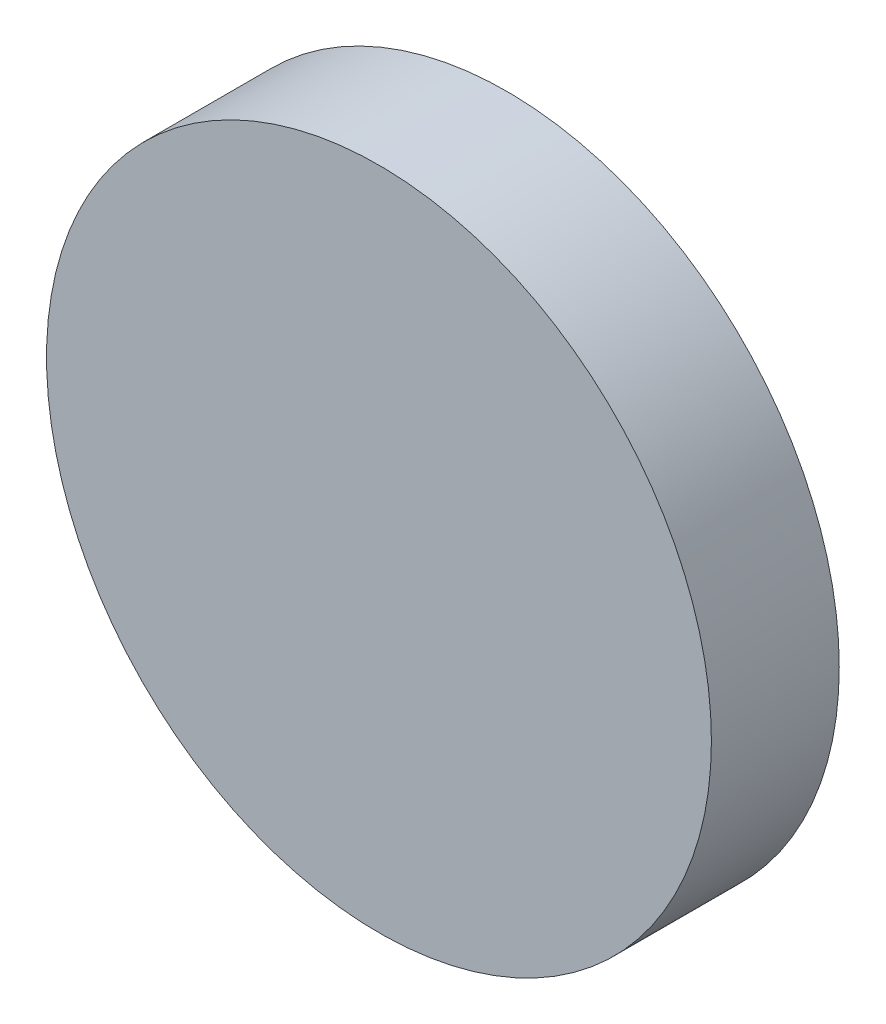
ISO-10303-21;
HEADER;
FILE_DESCRIPTION(('STEP AP214'),'2;1');
FILE_NAME('part.step','',(''),(''),'','','');
FILE_SCHEMA(('AUTOMOTIVE_DESIGN { 1 0 10303 214 1 1 1 1 }'));
ENDSEC;
DATA;
#1=APPLICATION_CONTEXT('core data for automotive mechanical design processes');
#2=APPLICATION_PROTOCOL_DEFINITION('international standard','automotive_design',2000,#1);
#3=PRODUCT_CONTEXT('',#1,'mechanical');
#4=PRODUCT('Part','Part','',(#3));
#5=PRODUCT_RELATED_PRODUCT_CATEGORY('part','',(#4));
#6=PRODUCT_DEFINITION_FORMATION('','',#4);
#7=PRODUCT_DEFINITION_CONTEXT('part definition',#1,'design');
#8=PRODUCT_DEFINITION('design','',#6,#7);
#9=PRODUCT_DEFINITION_SHAPE('','',#8);
#10=(LENGTH_UNIT() NAMED_UNIT(*) SI_UNIT(.MILLI.,.METRE.));
#11=(NAMED_UNIT(*) PLANE_ANGLE_UNIT() SI_UNIT($,.RADIAN.));
#12=(NAMED_UNIT(*) SI_UNIT($,.STERADIAN.) SOLID_ANGLE_UNIT());
#13=UNCERTAINTY_MEASURE_WITH_UNIT(LENGTH_MEASURE(1.E-05),#10,'distance_accuracy_value','');
#14=(GEOMETRIC_REPRESENTATION_CONTEXT(3) GLOBAL_UNCERTAINTY_ASSIGNED_CONTEXT((#13)) GLOBAL_UNIT_ASSIGNED_CONTEXT((#10,
#11,#12)) REPRESENTATION_CONTEXT('',''));
#15=CARTESIAN_POINT('',(0.,0.,0.));
#16=DIRECTION('',(0.,0.,1.));
#17=DIRECTION('',(1.,0.,0.));
#18=AXIS2_PLACEMENT_3D('',#15,#16,#17);
#19=CARTESIAN_POINT('',(0.,0.,50.));
#20=DIRECTION('',(0.,0.,-1.));
#21=DIRECTION('',(-1.,0.,0.));
#22=AXIS2_PLACEMENT_3D('',#19,#20,#21);
#23=CYLINDRICAL_SURFACE('',#22,130.);
#24=CARTESIAN_POINT('',(0.,0.,50.));
#25=DIRECTION('',(0.,0.,1.));
#26=DIRECTION('',(1.,0.,0.));
#27=AXIS2_PLACEMENT_3D('',#24,#25,#26);
#28=CIRCLE('',#27,130.);
#29=CARTESIAN_POINT('',(130.,0.,50.));
#30=VERTEX_POINT('',#29);
#31=EDGE_CURVE('E52',#30,#30,#28,.T.);
#32=ORIENTED_EDGE('',*,*,#31,.F.);
#33=EDGE_LOOP('',(#32));
#34=FACE_BOUND('',#33,.T.);
#35=CARTESIAN_POINT('',(0.,0.,0.));
#36=DIRECTION('',(0.,0.,1.));
#37=DIRECTION('',(1.,0.,0.));
#38=AXIS2_PLACEMENT_3D('',#35,#36,#37);
#39=CIRCLE('',#38,130.);
#40=CARTESIAN_POINT('',(130.,0.,0.));
#41=VERTEX_POINT('',#40);
#42=EDGE_CURVE('E53',#41,#41,#39,.T.);
#43=ORIENTED_EDGE('',*,*,#42,.T.);
#44=EDGE_LOOP('',(#43));
#45=FACE_BOUND('',#44,.T.);
#46=ADVANCED_FACE('F33',(#34,#45),#23,.T.);
#47=CARTESIAN_POINT('',(0.,0.,50.));
#48=DIRECTION('',(0.,0.,1.));
#49=DIRECTION('',(1.,0.,0.));
#50=AXIS2_PLACEMENT_3D('',#47,#48,#49);
#51=PLANE('',#50);
#52=ORIENTED_EDGE('',*,*,#31,.T.);
#53=EDGE_LOOP('',(#52));
#54=FACE_BOUND('',#53,.T.);
#55=ADVANCED_FACE('F86',(#54),#51,.T.);
#56=CARTESIAN_POINT('',(0.,0.,0.));
#57=DIRECTION('',(0.,0.,1.));
#58=DIRECTION('',(1.,0.,0.));
#59=AXIS2_PLACEMENT_3D('',#56,#57,#58);
#60=PLANE('',#59);
#61=CARTESIAN_POINT('',(-56.5685424949238,-56.5685424949238,0.));
#62=DIRECTION('',(0.,0.,1.));
#63=DIRECTION('',(1.,0.,0.));
#64=AXIS2_PLACEMENT_3D('',#61,#62,#63);
#65=CIRCLE('',#64,10.);
#66=CARTESIAN_POINT('',(-46.5685424949238,-56.5685424949238,0.));
#67=VERTEX_POINT('',#66);
#68=EDGE_CURVE('E10',#67,#67,#65,.F.);
#69=ORIENTED_EDGE('',*,*,#68,.F.);
#70=EDGE_LOOP('',(#69));
#71=FACE_BOUND('',#70,.T.);
#72=CARTESIAN_POINT('',(56.5685424949238,-56.5685424949238,0.));
#73=DIRECTION('',(0.,0.,1.));
#74=DIRECTION('',(1.,0.,0.));
#75=AXIS2_PLACEMENT_3D('',#72,#73,#74);
#76=CIRCLE('',#75,10.);
#77=CARTESIAN_POINT('',(66.5685424949238,-56.5685424949238,0.));
#78=VERTEX_POINT('',#77);
#79=EDGE_CURVE('E39',#78,#78,#76,.F.);
#80=ORIENTED_EDGE('',*,*,#79,.F.);
#81=EDGE_LOOP('',(#80));
#82=FACE_BOUND('',#81,.T.);
#83=CARTESIAN_POINT('',(-56.5685424949238,56.5685424949238,0.));
#84=DIRECTION('',(0.,0.,1.));
#85=DIRECTION('',(1.,0.,0.));
#86=AXIS2_PLACEMENT_3D('',#83,#84,#85);
#87=CIRCLE('',#86,9.99999999999999);
#88=CARTESIAN_POINT('',(-46.5685424949238,56.5685424949238,0.));
#89=VERTEX_POINT('',#88);
#90=EDGE_CURVE('E43',#89,#89,#87,.F.);
#91=ORIENTED_EDGE('',*,*,#90,.F.);
#92=EDGE_LOOP('',(#91));
#93=FACE_BOUND('',#92,.T.);
#94=CARTESIAN_POINT('',(56.5685424949238,56.5685424949238,0.));
#95=DIRECTION('',(0.,0.,1.));
#96=DIRECTION('',(1.,0.,0.));
#97=AXIS2_PLACEMENT_3D('',#94,#95,#96);
#98=CIRCLE('',#97,10.);
#99=CARTESIAN_POINT('',(66.5685424949238,56.5685424949238,0.));
#100=VERTEX_POINT('',#99);
#101=EDGE_CURVE('E47',#100,#100,#98,.F.);
#102=ORIENTED_EDGE('',*,*,#101,.F.);
#103=EDGE_LOOP('',(#102));
#104=FACE_BOUND('',#103,.T.);
#105=ORIENTED_EDGE('',*,*,#42,.F.);
#106=EDGE_LOOP('',(#105));
#107=FACE_BOUND('',#106,.T.);
#108=ADVANCED_FACE('F91',(#71,#82,#93,#104,#107),#60,.F.);
#109=CARTESIAN_POINT('',(56.5685424949238,56.5685424949238,-10.));
#110=DIRECTION('',(0.,0.,1.));
#111=DIRECTION('',(1.,0.,0.));
#112=AXIS2_PLACEMENT_3D('',#109,#110,#111);
#113=CYLINDRICAL_SURFACE('',#112,10.);
#114=CARTESIAN_POINT('',(56.5685424949238,56.5685424949238,-10.));
#115=DIRECTION('',(0.,0.,-1.));
#116=DIRECTION('',(-1.,0.,0.));
#117=AXIS2_PLACEMENT_3D('',#114,#115,#116);
#118=CIRCLE('',#117,10.);
#119=CARTESIAN_POINT('',(46.5685424949238,56.5685424949238,-10.));
#120=VERTEX_POINT('',#119);
#121=EDGE_CURVE('E56',#120,#120,#118,.T.);
#122=ORIENTED_EDGE('',*,*,#121,.F.);
#123=EDGE_LOOP('',(#122));
#124=FACE_BOUND('',#123,.T.);
#125=ORIENTED_EDGE('',*,*,#101,.T.);
#126=EDGE_LOOP('',(#125));
#127=FACE_BOUND('',#126,.T.);
#128=ADVANCED_FACE('F99',(#124,#127),#113,.T.);
#129=CARTESIAN_POINT('',(56.5685424949238,56.5685424949238,-10.));
#130=DIRECTION('',(0.,0.,-1.));
#131=DIRECTION('',(-1.,0.,0.));
#132=AXIS2_PLACEMENT_3D('',#129,#130,#131);
#133=PLANE('',#132);
#134=ORIENTED_EDGE('',*,*,#121,.T.);
#135=EDGE_LOOP('',(#134));
#136=FACE_BOUND('',#135,.T.);
#137=ADVANCED_FACE('F104',(#136),#133,.T.);
#138=CARTESIAN_POINT('',(-56.5685424949238,56.5685424949238,-10.));
#139=DIRECTION('',(0.,0.,1.));
#140=DIRECTION('',(1.,0.,0.));
#141=AXIS2_PLACEMENT_3D('',#138,#139,#140);
#142=CYLINDRICAL_SURFACE('',#141,9.99999999999999);
#143=CARTESIAN_POINT('',(-56.5685424949238,56.5685424949238,-10.));
#144=DIRECTION('',(0.,0.,-1.));
#145=DIRECTION('',(-1.,0.,0.));
#146=AXIS2_PLACEMENT_3D('',#143,#144,#145);
#147=CIRCLE('',#146,9.99999999999999);
#148=CARTESIAN_POINT('',(-66.5685424949238,56.5685424949238,-10.));
#149=VERTEX_POINT('',#148);
#150=EDGE_CURVE('E61',#149,#149,#147,.T.);
#151=ORIENTED_EDGE('',*,*,#150,.F.);
#152=EDGE_LOOP('',(#151));
#153=FACE_BOUND('',#152,.T.);
#154=ORIENTED_EDGE('',*,*,#90,.T.);
#155=EDGE_LOOP('',(#154));
#156=FACE_BOUND('',#155,.T.);
#157=ADVANCED_FACE('F111',(#153,#156),#142,.T.);
#158=CARTESIAN_POINT('',(-56.5685424949238,56.5685424949238,-10.));
#159=DIRECTION('',(0.,0.,-1.));
#160=DIRECTION('',(-1.,0.,0.));
#161=AXIS2_PLACEMENT_3D('',#158,#159,#160);
#162=PLANE('',#161);
#163=ORIENTED_EDGE('',*,*,#150,.T.);
#164=EDGE_LOOP('',(#163));
#165=FACE_BOUND('',#164,.T.);
#166=ADVANCED_FACE('F115',(#165),#162,.T.);
#167=CARTESIAN_POINT('',(56.5685424949238,-56.5685424949238,-10.));
#168=DIRECTION('',(0.,0.,1.));
#169=DIRECTION('',(1.,0.,0.));
#170=AXIS2_PLACEMENT_3D('',#167,#168,#169);
#171=CYLINDRICAL_SURFACE('',#170,10.);
#172=CARTESIAN_POINT('',(56.5685424949238,-56.5685424949238,-10.));
#173=DIRECTION('',(0.,0.,-1.));
#174=DIRECTION('',(-1.,0.,0.));
#175=AXIS2_PLACEMENT_3D('',#172,#173,#174);
#176=CIRCLE('',#175,10.);
#177=CARTESIAN_POINT('',(46.5685424949238,-56.5685424949238,-10.));
#178=VERTEX_POINT('',#177);
#179=EDGE_CURVE('E64',#178,#178,#176,.T.);
#180=ORIENTED_EDGE('',*,*,#179,.F.);
#181=EDGE_LOOP('',(#180));
#182=FACE_BOUND('',#181,.T.);
#183=ORIENTED_EDGE('',*,*,#79,.T.);
#184=EDGE_LOOP('',(#183));
#185=FACE_BOUND('',#184,.T.);
#186=ADVANCED_FACE('F82',(#182,#185),#171,.T.);
#187=CARTESIAN_POINT('',(56.5685424949238,-56.5685424949238,-10.));
#188=DIRECTION('',(0.,0.,-1.));
#189=DIRECTION('',(-1.,0.,0.));
#190=AXIS2_PLACEMENT_3D('',#187,#188,#189);
#191=PLANE('',#190);
#192=ORIENTED_EDGE('',*,*,#179,.T.);
#193=EDGE_LOOP('',(#192));
#194=FACE_BOUND('',#193,.T.);
#195=ADVANCED_FACE('F75',(#194),#191,.T.);
#196=CARTESIAN_POINT('',(-56.5685424949238,-56.5685424949238,-10.));
#197=DIRECTION('',(0.,0.,1.));
#198=DIRECTION('',(1.,0.,0.));
#199=AXIS2_PLACEMENT_3D('',#196,#197,#198);
#200=CYLINDRICAL_SURFACE('',#199,10.);
#201=CARTESIAN_POINT('',(-56.5685424949238,-56.5685424949238,-10.));
#202=DIRECTION('',(0.,0.,-1.));
#203=DIRECTION('',(-1.,0.,0.));
#204=AXIS2_PLACEMENT_3D('',#201,#202,#203);
#205=CIRCLE('',#204,10.);
#206=CARTESIAN_POINT('',(-66.5685424949238,-56.5685424949238,-10.));
#207=VERTEX_POINT('',#206);
#208=EDGE_CURVE('E67',#207,#207,#205,.T.);
#209=ORIENTED_EDGE('',*,*,#208,.F.);
#210=EDGE_LOOP('',(#209));
#211=FACE_BOUND('',#210,.T.);
#212=ORIENTED_EDGE('',*,*,#68,.T.);
#213=EDGE_LOOP('',(#212));
#214=FACE_BOUND('',#213,.T.);
#215=ADVANCED_FACE('F73',(#211,#214),#200,.T.);
#216=CARTESIAN_POINT('',(-56.5685424949238,-56.5685424949238,-10.));
#217=DIRECTION('',(0.,0.,-1.));
#218=DIRECTION('',(-1.,0.,0.));
#219=AXIS2_PLACEMENT_3D('',#216,#217,#218);
#220=PLANE('',#219);
#221=ORIENTED_EDGE('',*,*,#208,.T.);
#222=EDGE_LOOP('',(#221));
#223=FACE_BOUND('',#222,.T.);
#224=ADVANCED_FACE('F71',(#223),#220,.T.);
#225=CLOSED_SHELL('',(#46,#55,#108,#128,#137,#157,#166,#186,#195,#215,#224));
#226=MANIFOLD_SOLID_BREP('B2',#225);
#227=ADVANCED_BREP_SHAPE_REPRESENTATION('',(#18,#226),#14);
#228=SHAPE_DEFINITION_REPRESENTATION(#9,#227);
ENDSEC;
END-ISO-10303-21;
